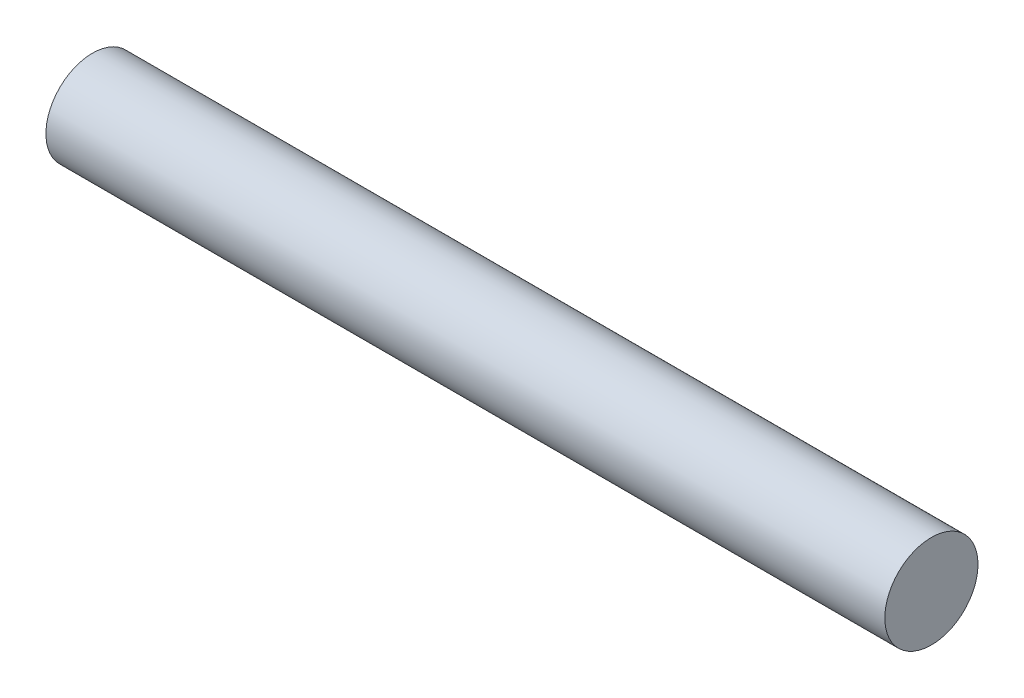
ISO-10303-21;
HEADER;
FILE_DESCRIPTION(('STEP AP214'),'2;1');
FILE_NAME('part.step','',(''),(''),'','','');
FILE_SCHEMA(('AUTOMOTIVE_DESIGN { 1 0 10303 214 1 1 1 1 }'));
ENDSEC;
DATA;
#1=APPLICATION_CONTEXT('core data for automotive mechanical design processes');
#2=APPLICATION_PROTOCOL_DEFINITION('international standard','automotive_design',2000,#1);
#3=PRODUCT_CONTEXT('',#1,'mechanical');
#4=PRODUCT('Part','Part','',(#3));
#5=PRODUCT_RELATED_PRODUCT_CATEGORY('part','',(#4));
#6=PRODUCT_DEFINITION_FORMATION('','',#4);
#7=PRODUCT_DEFINITION_CONTEXT('part definition',#1,'design');
#8=PRODUCT_DEFINITION('design','',#6,#7);
#9=PRODUCT_DEFINITION_SHAPE('','',#8);
#10=(LENGTH_UNIT() NAMED_UNIT(*) SI_UNIT(.MILLI.,.METRE.));
#11=(NAMED_UNIT(*) PLANE_ANGLE_UNIT() SI_UNIT($,.RADIAN.));
#12=(NAMED_UNIT(*) SI_UNIT($,.STERADIAN.) SOLID_ANGLE_UNIT());
#13=UNCERTAINTY_MEASURE_WITH_UNIT(LENGTH_MEASURE(1.E-05),#10,'distance_accuracy_value','');
#14=(GEOMETRIC_REPRESENTATION_CONTEXT(3) GLOBAL_UNCERTAINTY_ASSIGNED_CONTEXT((#13)) GLOBAL_UNIT_ASSIGNED_CONTEXT((#10,
#11,#12)) REPRESENTATION_CONTEXT('',''));
#15=CARTESIAN_POINT('',(0.,0.,0.));
#16=DIRECTION('',(0.,0.,1.));
#17=DIRECTION('',(1.,0.,0.));
#18=AXIS2_PLACEMENT_3D('',#15,#16,#17);
#19=CARTESIAN_POINT('',(57.15,0.,0.));
#20=DIRECTION('',(-1.,0.,0.));
#21=DIRECTION('',(0.,0.,1.));
#22=AXIS2_PLACEMENT_3D('',#19,#20,#21);
#23=CYLINDRICAL_SURFACE('',#22,3.175);
#24=CARTESIAN_POINT('',(57.15,0.,0.));
#25=DIRECTION('',(1.,0.,0.));
#26=DIRECTION('',(0.,0.,-1.));
#27=AXIS2_PLACEMENT_3D('',#24,#25,#26);
#28=CIRCLE('',#27,3.175);
#29=CARTESIAN_POINT('',(57.15,0.,-3.175));
#30=VERTEX_POINT('',#29);
#31=EDGE_CURVE('E10',#30,#30,#28,.T.);
#32=ORIENTED_EDGE('',*,*,#31,.F.);
#33=EDGE_LOOP('',(#32));
#34=FACE_BOUND('',#33,.T.);
#35=CARTESIAN_POINT('',(0.,0.,0.));
#36=DIRECTION('',(1.,0.,0.));
#37=DIRECTION('',(0.,0.,-1.));
#38=AXIS2_PLACEMENT_3D('',#35,#36,#37);
#39=CIRCLE('',#38,3.175);
#40=CARTESIAN_POINT('',(0.,0.,-3.175));
#41=VERTEX_POINT('',#40);
#42=EDGE_CURVE('E35',#41,#41,#39,.T.);
#43=ORIENTED_EDGE('',*,*,#42,.T.);
#44=EDGE_LOOP('',(#43));
#45=FACE_BOUND('',#44,.T.);
#46=ADVANCED_FACE('F32',(#34,#45),#23,.T.);
#47=CARTESIAN_POINT('',(57.15,0.,0.));
#48=DIRECTION('',(1.,0.,0.));
#49=DIRECTION('',(0.,0.,-1.));
#50=AXIS2_PLACEMENT_3D('',#47,#48,#49);
#51=PLANE('',#50);
#52=ORIENTED_EDGE('',*,*,#31,.T.);
#53=EDGE_LOOP('',(#52));
#54=FACE_BOUND('',#53,.T.);
#55=ADVANCED_FACE('F47',(#54),#51,.T.);
#56=CARTESIAN_POINT('',(0.,0.,0.));
#57=DIRECTION('',(1.,0.,0.));
#58=DIRECTION('',(0.,0.,-1.));
#59=AXIS2_PLACEMENT_3D('',#56,#57,#58);
#60=PLANE('',#59);
#61=ORIENTED_EDGE('',*,*,#42,.F.);
#62=EDGE_LOOP('',(#61));
#63=FACE_BOUND('',#62,.T.);
#64=ADVANCED_FACE('F45',(#63),#60,.F.);
#65=CLOSED_SHELL('',(#46,#55,#64));
#66=MANIFOLD_SOLID_BREP('B2',#65);
#67=ADVANCED_BREP_SHAPE_REPRESENTATION('',(#18,#66),#14);
#68=SHAPE_DEFINITION_REPRESENTATION(#9,#67);
ENDSEC;
END-ISO-10303-21;
